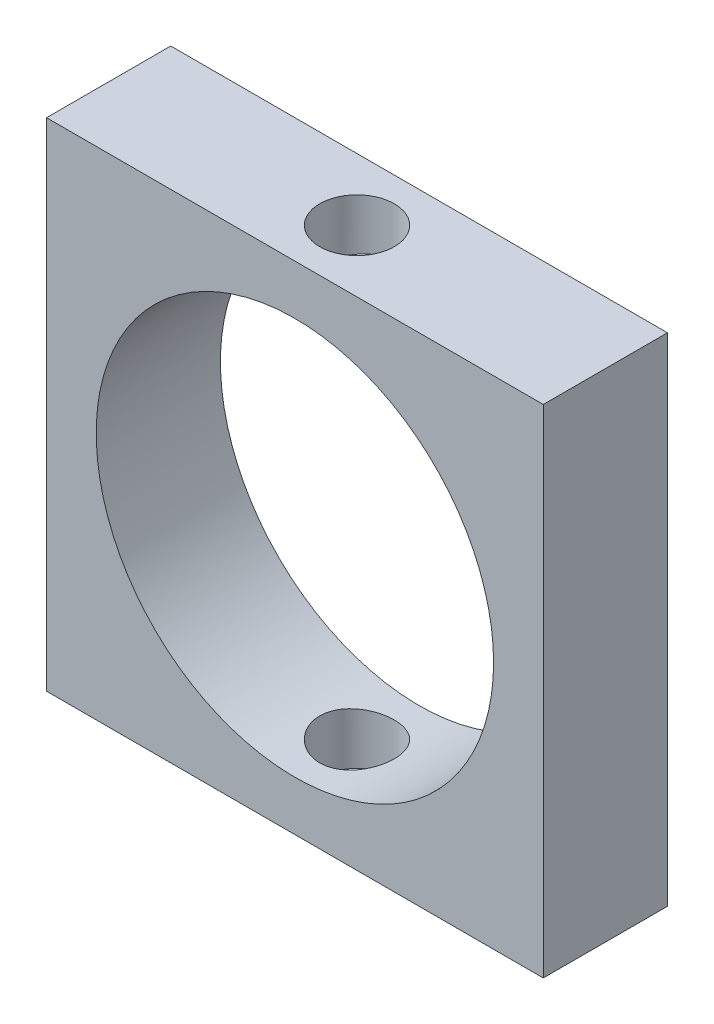
ISO-10303-21;
HEADER;
FILE_DESCRIPTION(('STEP AP214'),'2;1');
FILE_NAME('part.step','',(''),(''),'','','');
FILE_SCHEMA(('AUTOMOTIVE_DESIGN { 1 0 10303 214 1 1 1 1 }'));
ENDSEC;
DATA;
#1=APPLICATION_CONTEXT('core data for automotive mechanical design processes');
#2=APPLICATION_PROTOCOL_DEFINITION('international standard','automotive_design',2000,#1);
#3=PRODUCT_CONTEXT('',#1,'mechanical');
#4=PRODUCT('Part','Part','',(#3));
#5=PRODUCT_RELATED_PRODUCT_CATEGORY('part','',(#4));
#6=PRODUCT_DEFINITION_FORMATION('','',#4);
#7=PRODUCT_DEFINITION_CONTEXT('part definition',#1,'design');
#8=PRODUCT_DEFINITION('design','',#6,#7);
#9=PRODUCT_DEFINITION_SHAPE('','',#8);
#10=(LENGTH_UNIT() NAMED_UNIT(*) SI_UNIT(.MILLI.,.METRE.));
#11=(NAMED_UNIT(*) PLANE_ANGLE_UNIT() SI_UNIT($,.RADIAN.));
#12=(NAMED_UNIT(*) SI_UNIT($,.STERADIAN.) SOLID_ANGLE_UNIT());
#13=UNCERTAINTY_MEASURE_WITH_UNIT(LENGTH_MEASURE(1.E-05),#10,'distance_accuracy_value','');
#14=(GEOMETRIC_REPRESENTATION_CONTEXT(3) GLOBAL_UNCERTAINTY_ASSIGNED_CONTEXT((#13)) GLOBAL_UNIT_ASSIGNED_CONTEXT((#10,
#11,#12)) REPRESENTATION_CONTEXT('',''));
#15=CARTESIAN_POINT('',(0.,0.,0.));
#16=DIRECTION('',(0.,0.,1.));
#17=DIRECTION('',(1.,0.,0.));
#18=AXIS2_PLACEMENT_3D('',#15,#16,#17);
#19=CARTESIAN_POINT('',(0.,0.,5.));
#20=DIRECTION('',(0.,0.,-1.));
#21=DIRECTION('',(-1.,0.,0.));
#22=AXIS2_PLACEMENT_3D('',#19,#20,#21);
#23=PLANE('',#22);
#24=DIRECTION('',(0.,1.,0.));
#25=VECTOR('',#24,1.);
#26=CARTESIAN_POINT('',(10.,-10.,5.));
#27=LINE('',#26,#25);
#28=CARTESIAN_POINT('',(10.,-10.,5.));
#29=VERTEX_POINT('',#28);
#30=CARTESIAN_POINT('',(10.,10.,5.));
#31=VERTEX_POINT('',#30);
#32=EDGE_CURVE('E92',#29,#31,#27,.T.);
#33=ORIENTED_EDGE('',*,*,#32,.T.);
#34=DIRECTION('',(-1.,0.,0.));
#35=VECTOR('',#34,1.);
#36=CARTESIAN_POINT('',(-10.,10.,5.));
#37=LINE('',#36,#35);
#38=CARTESIAN_POINT('',(-10.,10.,5.));
#39=VERTEX_POINT('',#38);
#40=EDGE_CURVE('E87',#31,#39,#37,.T.);
#41=ORIENTED_EDGE('',*,*,#40,.T.);
#42=DIRECTION('',(0.,-1.,0.));
#43=VECTOR('',#42,1.);
#44=CARTESIAN_POINT('',(-10.,-10.,5.));
#45=LINE('',#44,#43);
#46=CARTESIAN_POINT('',(-10.,-10.,5.));
#47=VERTEX_POINT('',#46);
#48=EDGE_CURVE('E90',#39,#47,#45,.T.);
#49=ORIENTED_EDGE('',*,*,#48,.T.);
#50=DIRECTION('',(1.,0.,0.));
#51=VECTOR('',#50,1.);
#52=CARTESIAN_POINT('',(-10.,-10.,5.));
#53=LINE('',#52,#51);
#54=EDGE_CURVE('E57',#47,#29,#53,.T.);
#55=ORIENTED_EDGE('',*,*,#54,.T.);
#56=EDGE_LOOP('',(#33,#41,#49,#55));
#57=FACE_BOUND('',#56,.T.);
#58=CARTESIAN_POINT('',(0.,0.,5.));
#59=DIRECTION('',(0.,0.,1.));
#60=DIRECTION('',(1.,0.,0.));
#61=AXIS2_PLACEMENT_3D('',#58,#59,#60);
#62=CIRCLE('',#61,8.);
#63=CARTESIAN_POINT('',(8.,0.,5.));
#64=VERTEX_POINT('',#63);
#65=EDGE_CURVE('E108',#64,#64,#62,.T.);
#66=ORIENTED_EDGE('',*,*,#65,.F.);
#67=EDGE_LOOP('',(#66));
#68=FACE_BOUND('',#67,.T.);
#69=ADVANCED_FACE('F33',(#57,#68),#23,.F.);
#70=CARTESIAN_POINT('',(0.,0.,0.));
#71=DIRECTION('',(0.,0.,-1.));
#72=DIRECTION('',(-1.,0.,0.));
#73=AXIS2_PLACEMENT_3D('',#70,#71,#72);
#74=PLANE('',#73);
#75=DIRECTION('',(0.,1.,0.));
#76=VECTOR('',#75,1.);
#77=CARTESIAN_POINT('',(10.,-10.,0.));
#78=LINE('',#77,#76);
#79=CARTESIAN_POINT('',(10.,-10.,0.));
#80=VERTEX_POINT('',#79);
#81=CARTESIAN_POINT('',(10.,10.,0.));
#82=VERTEX_POINT('',#81);
#83=EDGE_CURVE('E105',#80,#82,#78,.T.);
#84=ORIENTED_EDGE('',*,*,#83,.F.);
#85=DIRECTION('',(1.,0.,0.));
#86=VECTOR('',#85,1.);
#87=CARTESIAN_POINT('',(-10.,-10.,0.));
#88=LINE('',#87,#86);
#89=CARTESIAN_POINT('',(-10.,-10.,0.));
#90=VERTEX_POINT('',#89);
#91=EDGE_CURVE('E80',#90,#80,#88,.T.);
#92=ORIENTED_EDGE('',*,*,#91,.F.);
#93=DIRECTION('',(0.,-1.,0.));
#94=VECTOR('',#93,1.);
#95=CARTESIAN_POINT('',(-10.,-10.,0.));
#96=LINE('',#95,#94);
#97=CARTESIAN_POINT('',(-10.,10.,0.));
#98=VERTEX_POINT('',#97);
#99=EDGE_CURVE('E74',#98,#90,#96,.T.);
#100=ORIENTED_EDGE('',*,*,#99,.F.);
#101=DIRECTION('',(-1.,0.,0.));
#102=VECTOR('',#101,1.);
#103=CARTESIAN_POINT('',(-10.,10.,0.));
#104=LINE('',#103,#102);
#105=EDGE_CURVE('E96',#82,#98,#104,.T.);
#106=ORIENTED_EDGE('',*,*,#105,.F.);
#107=EDGE_LOOP('',(#84,#92,#100,#106));
#108=FACE_BOUND('',#107,.T.);
#109=CARTESIAN_POINT('',(0.,0.,0.));
#110=DIRECTION('',(0.,0.,1.));
#111=DIRECTION('',(1.,0.,0.));
#112=AXIS2_PLACEMENT_3D('',#109,#110,#111);
#113=CIRCLE('',#112,8.);
#114=CARTESIAN_POINT('',(8.,0.,0.));
#115=VERTEX_POINT('',#114);
#116=EDGE_CURVE('E163',#115,#115,#113,.T.);
#117=ORIENTED_EDGE('',*,*,#116,.T.);
#118=EDGE_LOOP('',(#117));
#119=FACE_BOUND('',#118,.T.);
#120=ADVANCED_FACE('F137',(#108,#119),#74,.T.);
#121=CARTESIAN_POINT('',(10.,-10.,5.));
#122=DIRECTION('',(-1.,0.,0.));
#123=DIRECTION('',(0.,0.,1.));
#124=AXIS2_PLACEMENT_3D('',#121,#122,#123);
#125=PLANE('',#124);
#126=ORIENTED_EDGE('',*,*,#83,.T.);
#127=DIRECTION('',(0.,0.,-1.));
#128=VECTOR('',#127,1.);
#129=CARTESIAN_POINT('',(10.,10.,5.));
#130=LINE('',#129,#128);
#131=EDGE_CURVE('E11',#31,#82,#130,.T.);
#132=ORIENTED_EDGE('',*,*,#131,.F.);
#133=ORIENTED_EDGE('',*,*,#32,.F.);
#134=DIRECTION('',(0.,0.,-1.));
#135=VECTOR('',#134,1.);
#136=CARTESIAN_POINT('',(10.,-10.,5.));
#137=LINE('',#136,#135);
#138=EDGE_CURVE('E101',#29,#80,#137,.T.);
#139=ORIENTED_EDGE('',*,*,#138,.T.);
#140=EDGE_LOOP('',(#126,#132,#133,#139));
#141=FACE_BOUND('',#140,.T.);
#142=ADVANCED_FACE('F35',(#141),#125,.F.);
#143=CARTESIAN_POINT('',(-10.,10.,5.));
#144=DIRECTION('',(0.,-1.,0.));
#145=DIRECTION('',(0.,0.,-1.));
#146=AXIS2_PLACEMENT_3D('',#143,#144,#145);
#147=PLANE('',#146);
#148=CARTESIAN_POINT('',(0.,10.,2.5));
#149=DIRECTION('',(0.,1.,0.));
#150=DIRECTION('',(0.,0.,1.));
#151=AXIS2_PLACEMENT_3D('',#148,#149,#150);
#152=CIRCLE('',#151,1.5);
#153=CARTESIAN_POINT('',(0.,10.,4.));
#154=VERTEX_POINT('',#153);
#155=EDGE_CURVE('E156',#154,#154,#152,.T.);
#156=ORIENTED_EDGE('',*,*,#155,.F.);
#157=EDGE_LOOP('',(#156));
#158=FACE_BOUND('',#157,.T.);
#159=ORIENTED_EDGE('',*,*,#105,.T.);
#160=DIRECTION('',(0.,0.,-1.));
#161=VECTOR('',#160,1.);
#162=CARTESIAN_POINT('',(-10.,10.,5.));
#163=LINE('',#162,#161);
#164=EDGE_CURVE('E48',#39,#98,#163,.T.);
#165=ORIENTED_EDGE('',*,*,#164,.F.);
#166=ORIENTED_EDGE('',*,*,#40,.F.);
#167=ORIENTED_EDGE('',*,*,#131,.T.);
#168=EDGE_LOOP('',(#159,#165,#166,#167));
#169=FACE_BOUND('',#168,.T.);
#170=ADVANCED_FACE('F95',(#158,#169),#147,.F.);
#171=CARTESIAN_POINT('',(-10.,-10.,5.));
#172=DIRECTION('',(1.,0.,0.));
#173=DIRECTION('',(0.,0.,-1.));
#174=AXIS2_PLACEMENT_3D('',#171,#172,#173);
#175=PLANE('',#174);
#176=ORIENTED_EDGE('',*,*,#99,.T.);
#177=DIRECTION('',(0.,0.,-1.));
#178=VECTOR('',#177,1.);
#179=CARTESIAN_POINT('',(-10.,-10.,5.));
#180=LINE('',#179,#178);
#181=EDGE_CURVE('E97',#47,#90,#180,.T.);
#182=ORIENTED_EDGE('',*,*,#181,.F.);
#183=ORIENTED_EDGE('',*,*,#48,.F.);
#184=ORIENTED_EDGE('',*,*,#164,.T.);
#185=EDGE_LOOP('',(#176,#182,#183,#184));
#186=FACE_BOUND('',#185,.T.);
#187=ADVANCED_FACE('F99',(#186),#175,.F.);
#188=CARTESIAN_POINT('',(-10.,-10.,5.));
#189=DIRECTION('',(0.,1.,0.));
#190=DIRECTION('',(0.,0.,1.));
#191=AXIS2_PLACEMENT_3D('',#188,#189,#190);
#192=PLANE('',#191);
#193=CARTESIAN_POINT('',(0.,-10.,2.5));
#194=DIRECTION('',(0.,1.,0.));
#195=DIRECTION('',(0.,0.,1.));
#196=AXIS2_PLACEMENT_3D('',#193,#194,#195);
#197=CIRCLE('',#196,1.5);
#198=CARTESIAN_POINT('',(0.,-10.,4.));
#199=VERTEX_POINT('',#198);
#200=EDGE_CURVE('E118',#199,#199,#197,.T.);
#201=ORIENTED_EDGE('',*,*,#200,.T.);
#202=EDGE_LOOP('',(#201));
#203=FACE_BOUND('',#202,.T.);
#204=ORIENTED_EDGE('',*,*,#91,.T.);
#205=ORIENTED_EDGE('',*,*,#138,.F.);
#206=ORIENTED_EDGE('',*,*,#54,.F.);
#207=ORIENTED_EDGE('',*,*,#181,.T.);
#208=EDGE_LOOP('',(#204,#205,#206,#207));
#209=FACE_BOUND('',#208,.T.);
#210=ADVANCED_FACE('F133',(#203,#209),#192,.F.);
#211=CARTESIAN_POINT('',(0.,0.,5.));
#212=DIRECTION('',(0.,0.,-1.));
#213=DIRECTION('',(-1.,0.,0.));
#214=AXIS2_PLACEMENT_3D('',#211,#212,#213);
#215=CYLINDRICAL_SURFACE('',#214,8.);
#216=CARTESIAN_POINT('',(0.,-8.,4.));
#217=CARTESIAN_POINT('',(0.0834717464654708,-7.99999848833852,3.99999681041172));
#218=CARTESIAN_POINT('',(0.166984992730098,-7.99868009921714,3.99300892338062));
#219=CARTESIAN_POINT('',(0.331658129841798,-7.9935478589052,3.96526000488165));
#220=CARTESIAN_POINT('',(0.412815974152225,-7.98973190166897,3.94448734936027));
#221=CARTESIAN_POINT('',(0.570372961851801,-7.98003138765458,3.88982729874066));
#222=CARTESIAN_POINT('',(0.646776330685344,-7.97414869946483,3.85595174754746));
#223=CARTESIAN_POINT('',(0.792807973094006,-7.96095710599783,3.77608112307718));
#224=CARTESIAN_POINT('',(0.862436794477323,-7.9536483161829,3.73008703085518));
#225=CARTESIAN_POINT('',(0.993783715930502,-7.93831336430504,3.62670023199633));
#226=CARTESIAN_POINT('',(1.05540895503183,-7.93028034856351,3.56919055532986));
#227=CARTESIAN_POINT('',(1.16819606135369,-7.9144531845865,3.44465669091244));
#228=CARTESIAN_POINT('',(1.21935717689241,-7.90665905354527,3.37763182023071));
#229=CARTESIAN_POINT('',(1.31014998665793,-7.89212551245005,3.23531391163603));
#230=CARTESIAN_POINT('',(1.34968721969605,-7.88539493886182,3.15995962968276));
#231=CARTESIAN_POINT('',(1.41550524332283,-7.87384713211987,3.00353108482321));
#232=CARTESIAN_POINT('',(1.44178717713098,-7.86902973396962,2.92245731588878));
#233=CARTESIAN_POINT('',(1.480050535035,-7.8619226957455,2.75788476908559));
#234=CARTESIAN_POINT('',(1.49219390192039,-7.85960445366405,2.67442490279654));
#235=CARTESIAN_POINT('',(1.50233808095346,-7.85767197152761,2.50662261519175));
#236=CARTESIAN_POINT('',(1.50034016135374,-7.8580574889876,2.4222802736977));
#237=CARTESIAN_POINT('',(1.48238979602362,-7.86146292701753,2.25628047473395));
#238=CARTESIAN_POINT('',(1.46662149996045,-7.86444808147334,2.17460228569985));
#239=CARTESIAN_POINT('',(1.42186799396207,-7.87266183284666,2.01507158021739));
#240=CARTESIAN_POINT('',(1.39288222239499,-7.87789052509516,1.9372192264907));
#241=CARTESIAN_POINT('',(1.322336471793,-7.89003855292589,1.78701132099974));
#242=CARTESIAN_POINT('',(1.28070213532456,-7.89696783823366,1.71469152941919));
#243=CARTESIAN_POINT('',(1.18609368930416,-7.91172971602918,1.57799527145977));
#244=CARTESIAN_POINT('',(1.13311842889266,-7.91956240015522,1.5136196122852));
#245=CARTESIAN_POINT('',(1.01633905685298,-7.93540001272164,1.39357504432754));
#246=CARTESIAN_POINT('',(0.952377436860682,-7.94340571024031,1.33805934754826));
#247=CARTESIAN_POINT('',(0.815968037098826,-7.95857386108318,1.2385227593246));
#248=CARTESIAN_POINT('',(0.743520172255769,-7.96573630595245,1.19450198312958));
#249=CARTESIAN_POINT('',(0.592034988874668,-7.97842539677509,1.11918224612998));
#250=CARTESIAN_POINT('',(0.512989564446494,-7.98394999136289,1.08789922088211));
#251=CARTESIAN_POINT('',(0.350639115398697,-7.99272505402719,1.03909790690784));
#252=CARTESIAN_POINT('',(0.267334544277787,-7.99597576367994,1.02157815595464));
#253=CARTESIAN_POINT('',(0.100148652903385,-7.99980360641981,1.00101396898173));
#254=CARTESIAN_POINT('',(0.0162940126341355,-8.00041950912279,0.997759608470273));
#255=CARTESIAN_POINT('',(-0.150761248092184,-7.99901543598228,1.00525547954765));
#256=CARTESIAN_POINT('',(-0.233961900480385,-7.99699558964431,1.01600502306526));
#257=CARTESIAN_POINT('',(-0.396681573218217,-7.99057111500406,1.05102903518337));
#258=CARTESIAN_POINT('',(-0.476224261046063,-7.98618522374031,1.07519728253781));
#259=CARTESIAN_POINT('',(-0.630128631824632,-7.97551842212498,1.13625770677879));
#260=CARTESIAN_POINT('',(-0.704489962595102,-7.96923738311334,1.17315074756579));
#261=CARTESIAN_POINT('',(-0.846816671513213,-7.95538030357666,1.25907812815951));
#262=CARTESIAN_POINT('',(-0.914703277015121,-7.94779086174563,1.30824073853684));
#263=CARTESIAN_POINT('',(-1.04133832326454,-7.93219343489712,1.41713813736236));
#264=CARTESIAN_POINT('',(-1.10008590976087,-7.92418541084687,1.47687391300133));
#265=CARTESIAN_POINT('',(-1.20757295872048,-7.9085247569745,1.60617231891143));
#266=CARTESIAN_POINT('',(-1.25616916218577,-7.90087825860257,1.67585490812539));
#267=CARTESIAN_POINT('',(-1.34096675057787,-7.88692985578532,1.82251762452375));
#268=CARTESIAN_POINT('',(-1.37716859613924,-7.8806279013735,1.89949748037047));
#269=CARTESIAN_POINT('',(-1.43594673512823,-7.87013024209574,2.05820586724254));
#270=CARTESIAN_POINT('',(-1.45858868794786,-7.86592440436878,2.13990937955933));
#271=CARTESIAN_POINT('',(-1.48980679326235,-7.86007203802415,2.3060472225214));
#272=CARTESIAN_POINT('',(-1.49838453270708,-7.8584252206579,2.3904812439704));
#273=CARTESIAN_POINT('',(-1.50117762148355,-7.85789199803857,2.55824833144151));
#274=CARTESIAN_POINT('',(-1.49561895003499,-7.85896215974293,2.641577580957));
#275=CARTESIAN_POINT('',(-1.47079175378803,-7.86364600659998,2.80609142204529));
#276=CARTESIAN_POINT('',(-1.45152331089332,-7.86725967655747,2.88727602642744));
#277=CARTESIAN_POINT('',(-1.39991887583263,-7.8766050802318,3.04507448479548));
#278=CARTESIAN_POINT('',(-1.36760735397252,-7.88233284594965,3.12169659134577));
#279=CARTESIAN_POINT('',(-1.29085868912204,-7.8952638755184,3.26846825424084));
#280=CARTESIAN_POINT('',(-1.24642068948186,-7.90246724360119,3.33861735284478));
#281=CARTESIAN_POINT('',(-1.14589487339535,-7.91767266107745,3.47158368004229));
#282=CARTESIAN_POINT('',(-1.08964259864303,-7.92568505353043,3.5342754125671));
#283=CARTESIAN_POINT('',(-0.967427926742291,-7.94152833918735,3.64940516246452));
#284=CARTESIAN_POINT('',(-0.901463301891616,-7.94935919027328,3.70184082098014));
#285=CARTESIAN_POINT('',(-0.760984945071873,-7.96403975968049,3.79541095262706));
#286=CARTESIAN_POINT('',(-0.686399590640516,-7.97088000990561,3.83643942849064));
#287=CARTESIAN_POINT('',(-0.531290113653833,-7.98271619380687,3.90531763660513));
#288=CARTESIAN_POINT('',(-0.450771651705248,-7.98771385879037,3.93317974704691));
#289=CARTESIAN_POINT('',(-0.308347202825154,-7.99428290707632,3.96927731441868));
#290=CARTESIAN_POINT('',(-0.24727381025187,-7.99641470878206,3.9807786303128));
#291=CARTESIAN_POINT('',(-0.124141247115157,-7.9992737995401,3.99614106211645));
#292=CARTESIAN_POINT('',(-0.0620821016527092,-8.00000112429805,4.00000237225591));
#293=CARTESIAN_POINT('',(0.,-8.,4.));
#294=B_SPLINE_CURVE_WITH_KNOTS('',3,(#216,#217,#218,#219,#220,#221,#222,#223,#224,#225,#226,
#227,#228,#229,#230,#231,#232,#233,#234,#235,#236,#237,#238,#239,#240,#241,#242,#243,#244,#245,
#246,#247,#248,#249,#250,#251,#252,#253,#254,#255,#256,#257,#258,#259,#260,#261,#262,#263,#264,
#265,#266,#267,#268,#269,#270,#271,#272,#273,#274,#275,#276,#277,#278,#279,#280,#281,#282,#283,
#284,#285,#286,#287,#288,#289,#290,#291,#292,#293),.UNSPECIFIED.,.T.,.F.,(4,2,2,2,2,2,2,2,2,2,2,
2,2,2,2,2,2,2,2,2,2,2,2,2,2,2,2,2,2,2,2,2,2,2,2,2,2,2,4),(0.,0.250188200964924,
0.500587642535452,0.750761271230907,1.00091465336891,1.2537511801363,1.50660586283617,
1.76146190504357,2.01629596311948,2.26818151445336,2.52004447587256,2.76859000612766,
3.01714609846787,3.26719262629531,3.51726454049859,3.77127768464077,4.02529337544948,
4.27962588321699,4.53393136673745,4.78448174076097,5.03501980464584,5.28360233907828,
5.53220175338032,5.78351778017708,6.03485728413098,6.28953436987299,6.54420198954945,
6.79762627818559,7.05102196946513,7.30039252231748,7.54976158541507,7.79866496207693,
8.04758592655423,8.3002336996638,8.55293951262255,8.80792048916315,9.06266126931173,
9.24874344524409,9.43482089039541),.UNSPECIFIED.);
#295=CARTESIAN_POINT('',(0.,-8.,4.));
#296=VERTEX_POINT('',#295);
#297=EDGE_CURVE('E37',#296,#296,#294,.T.);
#298=ORIENTED_EDGE('',*,*,#297,.F.);
#299=EDGE_LOOP('',(#298));
#300=FACE_BOUND('',#299,.T.);
#301=CARTESIAN_POINT('',(0.,8.,4.));
#302=CARTESIAN_POINT('',(-0.0834717464654708,7.99999848833852,3.99999681041172));
#303=CARTESIAN_POINT('',(-0.166984992730098,7.99868009921714,3.99300892338062));
#304=CARTESIAN_POINT('',(-0.331658129841798,7.9935478589052,3.96526000488165));
#305=CARTESIAN_POINT('',(-0.412815974152225,7.98973190166897,3.94448734936027));
#306=CARTESIAN_POINT('',(-0.570372961851801,7.98003138765458,3.88982729874066));
#307=CARTESIAN_POINT('',(-0.646776330685344,7.97414869946483,3.85595174754746));
#308=CARTESIAN_POINT('',(-0.792807973094006,7.96095710599783,3.77608112307718));
#309=CARTESIAN_POINT('',(-0.862436794477323,7.9536483161829,3.73008703085518));
#310=CARTESIAN_POINT('',(-0.993783715930502,7.93831336430504,3.62670023199633));
#311=CARTESIAN_POINT('',(-1.05540895503183,7.93028034856351,3.56919055532986));
#312=CARTESIAN_POINT('',(-1.16819606135369,7.9144531845865,3.44465669091244));
#313=CARTESIAN_POINT('',(-1.21935717689241,7.90665905354527,3.37763182023071));
#314=CARTESIAN_POINT('',(-1.31014998665793,7.89212551245005,3.23531391163603));
#315=CARTESIAN_POINT('',(-1.34968721969605,7.88539493886182,3.15995962968276));
#316=CARTESIAN_POINT('',(-1.41550524332283,7.87384713211987,3.00353108482321));
#317=CARTESIAN_POINT('',(-1.44178717713098,7.86902973396962,2.92245731588878));
#318=CARTESIAN_POINT('',(-1.480050535035,7.8619226957455,2.75788476908559));
#319=CARTESIAN_POINT('',(-1.49219390192039,7.85960445366405,2.67442490279654));
#320=CARTESIAN_POINT('',(-1.50233808095346,7.85767197152761,2.50662261519175));
#321=CARTESIAN_POINT('',(-1.50034016135374,7.8580574889876,2.4222802736977));
#322=CARTESIAN_POINT('',(-1.48238979602362,7.86146292701753,2.25628047473395));
#323=CARTESIAN_POINT('',(-1.46662149996045,7.86444808147334,2.17460228569985));
#324=CARTESIAN_POINT('',(-1.42186799396207,7.87266183284666,2.01507158021739));
#325=CARTESIAN_POINT('',(-1.39288222239499,7.87789052509516,1.9372192264907));
#326=CARTESIAN_POINT('',(-1.322336471793,7.89003855292589,1.78701132099974));
#327=CARTESIAN_POINT('',(-1.28070213532456,7.89696783823366,1.71469152941919));
#328=CARTESIAN_POINT('',(-1.18609368930416,7.91172971602918,1.57799527145977));
#329=CARTESIAN_POINT('',(-1.13311842889266,7.91956240015522,1.5136196122852));
#330=CARTESIAN_POINT('',(-1.01633905685298,7.93540001272164,1.39357504432754));
#331=CARTESIAN_POINT('',(-0.952377436860682,7.94340571024031,1.33805934754826));
#332=CARTESIAN_POINT('',(-0.815968037098826,7.95857386108318,1.2385227593246));
#333=CARTESIAN_POINT('',(-0.743520172255769,7.96573630595245,1.19450198312958));
#334=CARTESIAN_POINT('',(-0.592034988874668,7.97842539677509,1.11918224612998));
#335=CARTESIAN_POINT('',(-0.512989564446494,7.98394999136289,1.08789922088211));
#336=CARTESIAN_POINT('',(-0.350639115398697,7.99272505402719,1.03909790690784));
#337=CARTESIAN_POINT('',(-0.267334544277787,7.99597576367994,1.02157815595464));
#338=CARTESIAN_POINT('',(-0.100148652903385,7.99980360641981,1.00101396898173));
#339=CARTESIAN_POINT('',(-0.0162940126341355,8.00041950912279,0.997759608470273));
#340=CARTESIAN_POINT('',(0.150761248092184,7.99901543598228,1.00525547954765));
#341=CARTESIAN_POINT('',(0.233961900480385,7.99699558964431,1.01600502306526));
#342=CARTESIAN_POINT('',(0.396681573218217,7.99057111500406,1.05102903518337));
#343=CARTESIAN_POINT('',(0.476224261046063,7.98618522374031,1.07519728253781));
#344=CARTESIAN_POINT('',(0.630128631824632,7.97551842212498,1.13625770677879));
#345=CARTESIAN_POINT('',(0.704489962595102,7.96923738311334,1.17315074756579));
#346=CARTESIAN_POINT('',(0.846816671513213,7.95538030357666,1.25907812815951));
#347=CARTESIAN_POINT('',(0.914703277015121,7.94779086174563,1.30824073853684));
#348=CARTESIAN_POINT('',(1.04133832326454,7.93219343489712,1.41713813736236));
#349=CARTESIAN_POINT('',(1.10008590976087,7.92418541084687,1.47687391300133));
#350=CARTESIAN_POINT('',(1.20757295872048,7.9085247569745,1.60617231891143));
#351=CARTESIAN_POINT('',(1.25616916218577,7.90087825860257,1.67585490812539));
#352=CARTESIAN_POINT('',(1.34096675057787,7.88692985578532,1.82251762452375));
#353=CARTESIAN_POINT('',(1.37716859613924,7.8806279013735,1.89949748037047));
#354=CARTESIAN_POINT('',(1.43594673512823,7.87013024209574,2.05820586724254));
#355=CARTESIAN_POINT('',(1.45858868794786,7.86592440436878,2.13990937955933));
#356=CARTESIAN_POINT('',(1.48980679326235,7.86007203802415,2.3060472225214));
#357=CARTESIAN_POINT('',(1.49838453270708,7.8584252206579,2.3904812439704));
#358=CARTESIAN_POINT('',(1.50117762148355,7.85789199803857,2.55824833144151));
#359=CARTESIAN_POINT('',(1.49561895003499,7.85896215974293,2.641577580957));
#360=CARTESIAN_POINT('',(1.47079175378803,7.86364600659998,2.80609142204529));
#361=CARTESIAN_POINT('',(1.45152331089332,7.86725967655747,2.88727602642744));
#362=CARTESIAN_POINT('',(1.39991887583263,7.8766050802318,3.04507448479548));
#363=CARTESIAN_POINT('',(1.36760735397252,7.88233284594965,3.12169659134577));
#364=CARTESIAN_POINT('',(1.29085868912204,7.8952638755184,3.26846825424084));
#365=CARTESIAN_POINT('',(1.24642068948186,7.90246724360119,3.33861735284478));
#366=CARTESIAN_POINT('',(1.14589487339535,7.91767266107745,3.47158368004229));
#367=CARTESIAN_POINT('',(1.08964259864303,7.92568505353043,3.5342754125671));
#368=CARTESIAN_POINT('',(0.967427926742291,7.94152833918735,3.64940516246452));
#369=CARTESIAN_POINT('',(0.901463301891616,7.94935919027328,3.70184082098014));
#370=CARTESIAN_POINT('',(0.760984945071873,7.96403975968049,3.79541095262706));
#371=CARTESIAN_POINT('',(0.686399590640516,7.97088000990561,3.83643942849064));
#372=CARTESIAN_POINT('',(0.531290113653833,7.98271619380687,3.90531763660513));
#373=CARTESIAN_POINT('',(0.450771651705248,7.98771385879037,3.93317974704691));
#374=CARTESIAN_POINT('',(0.308347202825154,7.99428290707632,3.96927731441868));
#375=CARTESIAN_POINT('',(0.24727381025187,7.99641470878206,3.9807786303128));
#376=CARTESIAN_POINT('',(0.124141247115157,7.9992737995401,3.99614106211645));
#377=CARTESIAN_POINT('',(0.0620821016527092,8.00000112429805,4.00000237225591));
#378=CARTESIAN_POINT('',(0.,8.,4.));
#379=B_SPLINE_CURVE_WITH_KNOTS('',3,(#301,#302,#303,#304,#305,#306,#307,#308,#309,#310,#311,
#312,#313,#314,#315,#316,#317,#318,#319,#320,#321,#322,#323,#324,#325,#326,#327,#328,#329,#330,
#331,#332,#333,#334,#335,#336,#337,#338,#339,#340,#341,#342,#343,#344,#345,#346,#347,#348,#349,
#350,#351,#352,#353,#354,#355,#356,#357,#358,#359,#360,#361,#362,#363,#364,#365,#366,#367,#368,
#369,#370,#371,#372,#373,#374,#375,#376,#377,#378),.UNSPECIFIED.,.T.,.F.,(4,2,2,2,2,2,2,2,2,2,2,
2,2,2,2,2,2,2,2,2,2,2,2,2,2,2,2,2,2,2,2,2,2,2,2,2,2,2,4),(0.,0.250188200964924,
0.500587642535452,0.750761271230907,1.00091465336891,1.2537511801363,1.50660586283617,
1.76146190504357,2.01629596311948,2.26818151445336,2.52004447587256,2.76859000612766,
3.01714609846787,3.26719262629531,3.51726454049859,3.77127768464077,4.02529337544948,
4.27962588321699,4.53393136673745,4.78448174076097,5.03501980464584,5.28360233907828,
5.53220175338032,5.78351778017708,6.03485728413098,6.28953436987299,6.54420198954945,
6.79762627818559,7.05102196946513,7.30039252231748,7.54976158541507,7.79866496207693,
8.04758592655423,8.3002336996638,8.55293951262255,8.80792048916315,9.06266126931173,
9.24874344524409,9.43482089039541),.UNSPECIFIED.);
#380=CARTESIAN_POINT('',(0.,8.,4.));
#381=VERTEX_POINT('',#380);
#382=EDGE_CURVE('E113',#381,#381,#379,.T.);
#383=ORIENTED_EDGE('',*,*,#382,.F.);
#384=EDGE_LOOP('',(#383));
#385=FACE_BOUND('',#384,.T.);
#386=ORIENTED_EDGE('',*,*,#65,.T.);
#387=EDGE_LOOP('',(#386));
#388=FACE_BOUND('',#387,.T.);
#389=ORIENTED_EDGE('',*,*,#116,.F.);
#390=EDGE_LOOP('',(#389));
#391=FACE_BOUND('',#390,.T.);
#392=ADVANCED_FACE('F119',(#300,#385,#388,#391),#215,.F.);
#393=CARTESIAN_POINT('',(0.,-10.,2.5));
#394=DIRECTION('',(0.,1.,0.));
#395=DIRECTION('',(0.,0.,1.));
#396=AXIS2_PLACEMENT_3D('',#393,#394,#395);
#397=CYLINDRICAL_SURFACE('',#396,1.5);
#398=ORIENTED_EDGE('',*,*,#382,.T.);
#399=EDGE_LOOP('',(#398));
#400=FACE_BOUND('',#399,.T.);
#401=ORIENTED_EDGE('',*,*,#155,.T.);
#402=EDGE_LOOP('',(#401));
#403=FACE_BOUND('',#402,.T.);
#404=ADVANCED_FACE('F122',(#400,#403),#397,.F.);
#405=ORIENTED_EDGE('',*,*,#297,.T.);
#406=EDGE_LOOP('',(#405));
#407=FACE_BOUND('',#406,.T.);
#408=ORIENTED_EDGE('',*,*,#200,.F.);
#409=EDGE_LOOP('',(#408));
#410=FACE_BOUND('',#409,.T.);
#411=ADVANCED_FACE('F125',(#407,#410),#397,.F.);
#412=CLOSED_SHELL('',(#69,#120,#142,#170,#187,#210,#392,#404,#411));
#413=MANIFOLD_SOLID_BREP('B2',#412);
#414=ADVANCED_BREP_SHAPE_REPRESENTATION('',(#18,#413),#14);
#415=SHAPE_DEFINITION_REPRESENTATION(#9,#414);
ENDSEC;
END-ISO-10303-21;
